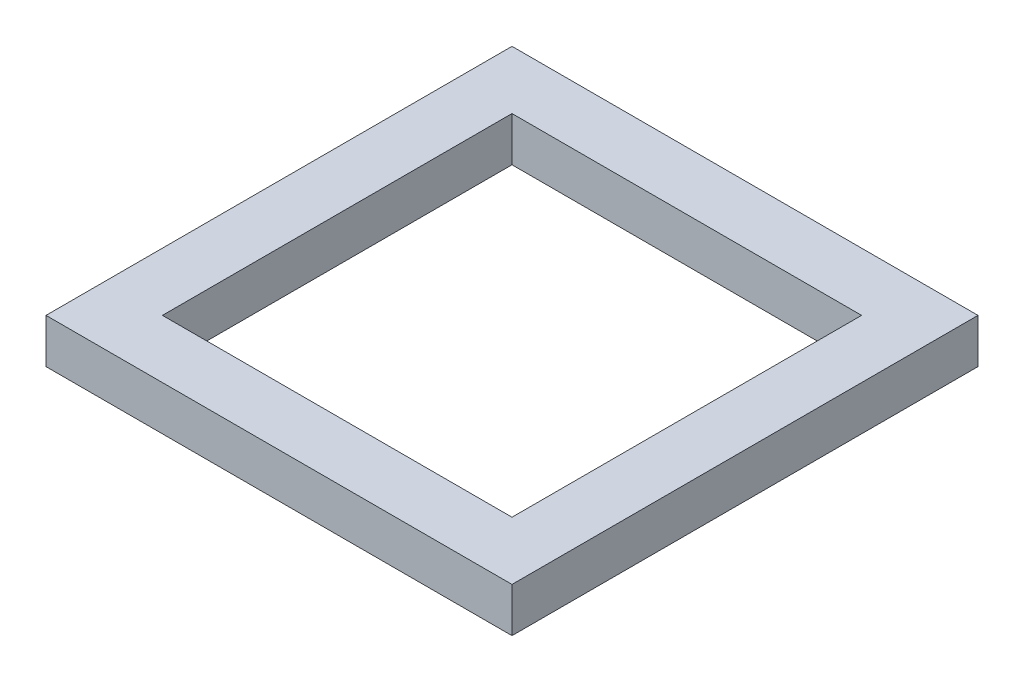
ISO-10303-21;
HEADER;
FILE_DESCRIPTION(('STEP AP214'),'2;1');
FILE_NAME('part.step','',(''),(''),'','','');
FILE_SCHEMA(('AUTOMOTIVE_DESIGN { 1 0 10303 214 1 1 1 1 }'));
ENDSEC;
DATA;
#1=APPLICATION_CONTEXT('core data for automotive mechanical design processes');
#2=APPLICATION_PROTOCOL_DEFINITION('international standard','automotive_design',2000,#1);
#3=PRODUCT_CONTEXT('',#1,'mechanical');
#4=PRODUCT('Part','Part','',(#3));
#5=PRODUCT_RELATED_PRODUCT_CATEGORY('part','',(#4));
#6=PRODUCT_DEFINITION_FORMATION('','',#4);
#7=PRODUCT_DEFINITION_CONTEXT('part definition',#1,'design');
#8=PRODUCT_DEFINITION('design','',#6,#7);
#9=PRODUCT_DEFINITION_SHAPE('','',#8);
#10=(LENGTH_UNIT() NAMED_UNIT(*) SI_UNIT(.MILLI.,.METRE.));
#11=(NAMED_UNIT(*) PLANE_ANGLE_UNIT() SI_UNIT($,.RADIAN.));
#12=(NAMED_UNIT(*) SI_UNIT($,.STERADIAN.) SOLID_ANGLE_UNIT());
#13=UNCERTAINTY_MEASURE_WITH_UNIT(LENGTH_MEASURE(1.E-05),#10,'distance_accuracy_value','');
#14=(GEOMETRIC_REPRESENTATION_CONTEXT(3) GLOBAL_UNCERTAINTY_ASSIGNED_CONTEXT((#13)) GLOBAL_UNIT_ASSIGNED_CONTEXT((#10,
#11,#12)) REPRESENTATION_CONTEXT('',''));
#15=CARTESIAN_POINT('',(0.,0.,0.));
#16=DIRECTION('',(0.,0.,1.));
#17=DIRECTION('',(1.,0.,0.));
#18=AXIS2_PLACEMENT_3D('',#15,#16,#17);
#19=CARTESIAN_POINT('',(0.,5.08,0.));
#20=DIRECTION('',(0.,1.,0.));
#21=DIRECTION('',(0.,0.,1.));
#22=AXIS2_PLACEMENT_3D('',#19,#20,#21);
#23=PLANE('',#22);
#24=DIRECTION('',(0.,0.,1.));
#25=VECTOR('',#24,1.);
#26=CARTESIAN_POINT('',(-17.9545454545455,5.08,-25.7954545454546));
#27=LINE('',#26,#25);
#28=CARTESIAN_POINT('',(-17.9545454545455,5.08,-25.7954545454546));
#29=VERTEX_POINT('',#28);
#30=CARTESIAN_POINT('',(-17.9545454545455,5.08,27.5245454545454));
#31=VERTEX_POINT('',#30);
#32=EDGE_CURVE('E134',#29,#31,#27,.T.);
#33=ORIENTED_EDGE('',*,*,#32,.T.);
#34=DIRECTION('',(1.,0.,0.));
#35=VECTOR('',#34,1.);
#36=CARTESIAN_POINT('',(-17.9545454545455,5.08,27.5245454545454));
#37=LINE('',#36,#35);
#38=CARTESIAN_POINT('',(35.3654545454545,5.08,27.5245454545454));
#39=VERTEX_POINT('',#38);
#40=EDGE_CURVE('E137',#31,#39,#37,.T.);
#41=ORIENTED_EDGE('',*,*,#40,.T.);
#42=DIRECTION('',(0.,0.,-1.));
#43=VECTOR('',#42,1.);
#44=CARTESIAN_POINT('',(35.3654545454545,5.08,-25.7954545454546));
#45=LINE('',#44,#43);
#46=CARTESIAN_POINT('',(35.3654545454545,5.08,-25.7954545454546));
#47=VERTEX_POINT('',#46);
#48=EDGE_CURVE('E140',#39,#47,#45,.T.);
#49=ORIENTED_EDGE('',*,*,#48,.T.);
#50=DIRECTION('',(-1.,0.,0.));
#51=VECTOR('',#50,1.);
#52=CARTESIAN_POINT('',(-17.9545454545455,5.08,-25.7954545454546));
#53=LINE('',#52,#51);
#54=EDGE_CURVE('E142',#47,#29,#53,.T.);
#55=ORIENTED_EDGE('',*,*,#54,.T.);
#56=EDGE_LOOP('',(#33,#41,#49,#55));
#57=FACE_BOUND('',#56,.T.);
#58=DIRECTION('',(1.,0.,0.));
#59=VECTOR('',#58,1.);
#60=CARTESIAN_POINT('',(-11.2945454545455,5.08,20.8645454545454));
#61=LINE('',#60,#59);
#62=CARTESIAN_POINT('',(-11.2945454545455,5.08,20.8645454545454));
#63=VERTEX_POINT('',#62);
#64=CARTESIAN_POINT('',(28.7054545454545,5.08,20.8645454545454));
#65=VERTEX_POINT('',#64);
#66=EDGE_CURVE('E106',#63,#65,#61,.T.);
#67=ORIENTED_EDGE('',*,*,#66,.F.);
#68=DIRECTION('',(0.,0.,1.));
#69=VECTOR('',#68,1.);
#70=CARTESIAN_POINT('',(-11.2945454545455,5.08,-19.1354545454546));
#71=LINE('',#70,#69);
#72=CARTESIAN_POINT('',(-11.2945454545455,5.08,-19.1354545454546));
#73=VERTEX_POINT('',#72);
#74=EDGE_CURVE('E98',#73,#63,#71,.T.);
#75=ORIENTED_EDGE('',*,*,#74,.F.);
#76=DIRECTION('',(-1.,0.,0.));
#77=VECTOR('',#76,1.);
#78=CARTESIAN_POINT('',(-11.2945454545455,5.08,-19.1354545454546));
#79=LINE('',#78,#77);
#80=CARTESIAN_POINT('',(28.7054545454545,5.08,-19.1354545454546));
#81=VERTEX_POINT('',#80);
#82=EDGE_CURVE('E120',#81,#73,#79,.T.);
#83=ORIENTED_EDGE('',*,*,#82,.F.);
#84=DIRECTION('',(0.,0.,-1.));
#85=VECTOR('',#84,1.);
#86=CARTESIAN_POINT('',(28.7054545454545,5.08,-19.1354545454546));
#87=LINE('',#86,#85);
#88=EDGE_CURVE('E118',#65,#81,#87,.T.);
#89=ORIENTED_EDGE('',*,*,#88,.F.);
#90=EDGE_LOOP('',(#67,#75,#83,#89));
#91=FACE_BOUND('',#90,.T.);
#92=ADVANCED_FACE('F33',(#57,#91),#23,.T.);
#93=CARTESIAN_POINT('',(0.,0.,0.));
#94=DIRECTION('',(0.,1.,0.));
#95=DIRECTION('',(0.,0.,1.));
#96=AXIS2_PLACEMENT_3D('',#93,#94,#95);
#97=PLANE('',#96);
#98=DIRECTION('',(0.,0.,1.));
#99=VECTOR('',#98,1.);
#100=CARTESIAN_POINT('',(-17.9545454545455,0.,-25.7954545454546));
#101=LINE('',#100,#99);
#102=CARTESIAN_POINT('',(-17.9545454545455,0.,-25.7954545454546));
#103=VERTEX_POINT('',#102);
#104=CARTESIAN_POINT('',(-17.9545454545455,0.,27.5245454545454));
#105=VERTEX_POINT('',#104);
#106=EDGE_CURVE('E114',#103,#105,#101,.T.);
#107=ORIENTED_EDGE('',*,*,#106,.F.);
#108=DIRECTION('',(-1.,0.,0.));
#109=VECTOR('',#108,1.);
#110=CARTESIAN_POINT('',(-17.9545454545455,0.,-25.7954545454546));
#111=LINE('',#110,#109);
#112=CARTESIAN_POINT('',(35.3654545454545,0.,-25.7954545454546));
#113=VERTEX_POINT('',#112);
#114=EDGE_CURVE('E138',#113,#103,#111,.T.);
#115=ORIENTED_EDGE('',*,*,#114,.F.);
#116=DIRECTION('',(0.,0.,-1.));
#117=VECTOR('',#116,1.);
#118=CARTESIAN_POINT('',(35.3654545454545,0.,-25.7954545454546));
#119=LINE('',#118,#117);
#120=CARTESIAN_POINT('',(35.3654545454545,0.,27.5245454545454));
#121=VERTEX_POINT('',#120);
#122=EDGE_CURVE('E149',#121,#113,#119,.T.);
#123=ORIENTED_EDGE('',*,*,#122,.F.);
#124=DIRECTION('',(1.,0.,0.));
#125=VECTOR('',#124,1.);
#126=CARTESIAN_POINT('',(-17.9545454545455,0.,27.5245454545454));
#127=LINE('',#126,#125);
#128=EDGE_CURVE('E147',#105,#121,#127,.T.);
#129=ORIENTED_EDGE('',*,*,#128,.F.);
#130=EDGE_LOOP('',(#107,#115,#123,#129));
#131=FACE_BOUND('',#130,.T.);
#132=DIRECTION('',(0.,0.,1.));
#133=VECTOR('',#132,1.);
#134=CARTESIAN_POINT('',(-11.2945454545455,0.,-19.1354545454546));
#135=LINE('',#134,#133);
#136=CARTESIAN_POINT('',(-11.2945454545455,0.,-19.1354545454546));
#137=VERTEX_POINT('',#136);
#138=CARTESIAN_POINT('',(-11.2945454545455,0.,20.8645454545454));
#139=VERTEX_POINT('',#138);
#140=EDGE_CURVE('E56',#137,#139,#135,.T.);
#141=ORIENTED_EDGE('',*,*,#140,.T.);
#142=DIRECTION('',(1.,0.,0.));
#143=VECTOR('',#142,1.);
#144=CARTESIAN_POINT('',(-11.2945454545455,0.,20.8645454545454));
#145=LINE('',#144,#143);
#146=CARTESIAN_POINT('',(28.7054545454545,0.,20.8645454545454));
#147=VERTEX_POINT('',#146);
#148=EDGE_CURVE('E113',#139,#147,#145,.T.);
#149=ORIENTED_EDGE('',*,*,#148,.T.);
#150=DIRECTION('',(0.,0.,-1.));
#151=VECTOR('',#150,1.);
#152=CARTESIAN_POINT('',(28.7054545454545,0.,-19.1354545454546));
#153=LINE('',#152,#151);
#154=CARTESIAN_POINT('',(28.7054545454545,0.,-19.1354545454546));
#155=VERTEX_POINT('',#154);
#156=EDGE_CURVE('E126',#147,#155,#153,.T.);
#157=ORIENTED_EDGE('',*,*,#156,.T.);
#158=DIRECTION('',(-1.,0.,0.));
#159=VECTOR('',#158,1.);
#160=CARTESIAN_POINT('',(-11.2945454545455,0.,-19.1354545454546));
#161=LINE('',#160,#159);
#162=EDGE_CURVE('E107',#155,#137,#161,.T.);
#163=ORIENTED_EDGE('',*,*,#162,.T.);
#164=EDGE_LOOP('',(#141,#149,#157,#163));
#165=FACE_BOUND('',#164,.T.);
#166=ADVANCED_FACE('F167',(#131,#165),#97,.F.);
#167=CARTESIAN_POINT('',(-17.9545454545455,5.08,-25.7954545454546));
#168=DIRECTION('',(1.,0.,0.));
#169=DIRECTION('',(0.,0.,-1.));
#170=AXIS2_PLACEMENT_3D('',#167,#168,#169);
#171=PLANE('',#170);
#172=ORIENTED_EDGE('',*,*,#106,.T.);
#173=DIRECTION('',(0.,-1.,0.));
#174=VECTOR('',#173,1.);
#175=CARTESIAN_POINT('',(-17.9545454545455,5.08,27.5245454545454));
#176=LINE('',#175,#174);
#177=EDGE_CURVE('E11',#31,#105,#176,.T.);
#178=ORIENTED_EDGE('',*,*,#177,.F.);
#179=ORIENTED_EDGE('',*,*,#32,.F.);
#180=DIRECTION('',(0.,-1.,0.));
#181=VECTOR('',#180,1.);
#182=CARTESIAN_POINT('',(-17.9545454545455,5.08,-25.7954545454546));
#183=LINE('',#182,#181);
#184=EDGE_CURVE('E144',#29,#103,#183,.T.);
#185=ORIENTED_EDGE('',*,*,#184,.T.);
#186=EDGE_LOOP('',(#172,#178,#179,#185));
#187=FACE_BOUND('',#186,.T.);
#188=ADVANCED_FACE('F35',(#187),#171,.F.);
#189=CARTESIAN_POINT('',(-17.9545454545455,5.08,27.5245454545454));
#190=DIRECTION('',(0.,0.,-1.));
#191=DIRECTION('',(-1.,0.,0.));
#192=AXIS2_PLACEMENT_3D('',#189,#190,#191);
#193=PLANE('',#192);
#194=ORIENTED_EDGE('',*,*,#128,.T.);
#195=DIRECTION('',(0.,-1.,0.));
#196=VECTOR('',#195,1.);
#197=CARTESIAN_POINT('',(35.3654545454545,5.08,27.5245454545454));
#198=LINE('',#197,#196);
#199=EDGE_CURVE('E41',#39,#121,#198,.T.);
#200=ORIENTED_EDGE('',*,*,#199,.F.);
#201=ORIENTED_EDGE('',*,*,#40,.F.);
#202=ORIENTED_EDGE('',*,*,#177,.T.);
#203=EDGE_LOOP('',(#194,#200,#201,#202));
#204=FACE_BOUND('',#203,.T.);
#205=ADVANCED_FACE('F177',(#204),#193,.F.);
#206=CARTESIAN_POINT('',(35.3654545454545,5.08,-25.7954545454546));
#207=DIRECTION('',(-1.,0.,0.));
#208=DIRECTION('',(0.,0.,1.));
#209=AXIS2_PLACEMENT_3D('',#206,#207,#208);
#210=PLANE('',#209);
#211=ORIENTED_EDGE('',*,*,#122,.T.);
#212=DIRECTION('',(0.,-1.,0.));
#213=VECTOR('',#212,1.);
#214=CARTESIAN_POINT('',(35.3654545454545,5.08,-25.7954545454546));
#215=LINE('',#214,#213);
#216=EDGE_CURVE('E154',#47,#113,#215,.T.);
#217=ORIENTED_EDGE('',*,*,#216,.F.);
#218=ORIENTED_EDGE('',*,*,#48,.F.);
#219=ORIENTED_EDGE('',*,*,#199,.T.);
#220=EDGE_LOOP('',(#211,#217,#218,#219));
#221=FACE_BOUND('',#220,.T.);
#222=ADVANCED_FACE('F161',(#221),#210,.F.);
#223=CARTESIAN_POINT('',(-17.9545454545455,5.08,-25.7954545454546));
#224=DIRECTION('',(0.,0.,1.));
#225=DIRECTION('',(1.,0.,0.));
#226=AXIS2_PLACEMENT_3D('',#223,#224,#225);
#227=PLANE('',#226);
#228=ORIENTED_EDGE('',*,*,#114,.T.);
#229=ORIENTED_EDGE('',*,*,#184,.F.);
#230=ORIENTED_EDGE('',*,*,#54,.F.);
#231=ORIENTED_EDGE('',*,*,#216,.T.);
#232=EDGE_LOOP('',(#228,#229,#230,#231));
#233=FACE_BOUND('',#232,.T.);
#234=ADVANCED_FACE('F171',(#233),#227,.F.);
#235=CARTESIAN_POINT('',(-11.2945454545455,5.08,-19.1354545454546));
#236=DIRECTION('',(1.,0.,0.));
#237=DIRECTION('',(0.,0.,-1.));
#238=AXIS2_PLACEMENT_3D('',#235,#236,#237);
#239=PLANE('',#238);
#240=ORIENTED_EDGE('',*,*,#140,.F.);
#241=DIRECTION('',(0.,-1.,0.));
#242=VECTOR('',#241,1.);
#243=CARTESIAN_POINT('',(-11.2945454545455,5.08,-19.1354545454546));
#244=LINE('',#243,#242);
#245=EDGE_CURVE('E102',#73,#137,#244,.T.);
#246=ORIENTED_EDGE('',*,*,#245,.F.);
#247=ORIENTED_EDGE('',*,*,#74,.T.);
#248=DIRECTION('',(0.,-1.,0.));
#249=VECTOR('',#248,1.);
#250=CARTESIAN_POINT('',(-11.2945454545455,5.08,20.8645454545454));
#251=LINE('',#250,#249);
#252=EDGE_CURVE('E101',#63,#139,#251,.T.);
#253=ORIENTED_EDGE('',*,*,#252,.T.);
#254=EDGE_LOOP('',(#240,#246,#247,#253));
#255=FACE_BOUND('',#254,.T.);
#256=ADVANCED_FACE('F100',(#255),#239,.T.);
#257=CARTESIAN_POINT('',(-11.2945454545455,5.08,20.8645454545454));
#258=DIRECTION('',(0.,0.,-1.));
#259=DIRECTION('',(-1.,0.,0.));
#260=AXIS2_PLACEMENT_3D('',#257,#258,#259);
#261=PLANE('',#260);
#262=ORIENTED_EDGE('',*,*,#148,.F.);
#263=ORIENTED_EDGE('',*,*,#252,.F.);
#264=ORIENTED_EDGE('',*,*,#66,.T.);
#265=DIRECTION('',(0.,-1.,0.));
#266=VECTOR('',#265,1.);
#267=CARTESIAN_POINT('',(28.7054545454545,5.08,20.8645454545454));
#268=LINE('',#267,#266);
#269=EDGE_CURVE('E115',#65,#147,#268,.T.);
#270=ORIENTED_EDGE('',*,*,#269,.T.);
#271=EDGE_LOOP('',(#262,#263,#264,#270));
#272=FACE_BOUND('',#271,.T.);
#273=ADVANCED_FACE('F110',(#272),#261,.T.);
#274=CARTESIAN_POINT('',(28.7054545454545,5.08,-19.1354545454546));
#275=DIRECTION('',(-1.,0.,0.));
#276=DIRECTION('',(0.,0.,1.));
#277=AXIS2_PLACEMENT_3D('',#274,#275,#276);
#278=PLANE('',#277);
#279=ORIENTED_EDGE('',*,*,#156,.F.);
#280=ORIENTED_EDGE('',*,*,#269,.F.);
#281=ORIENTED_EDGE('',*,*,#88,.T.);
#282=DIRECTION('',(0.,-1.,0.));
#283=VECTOR('',#282,1.);
#284=CARTESIAN_POINT('',(28.7054545454545,5.08,-19.1354545454546));
#285=LINE('',#284,#283);
#286=EDGE_CURVE('E48',#81,#155,#285,.T.);
#287=ORIENTED_EDGE('',*,*,#286,.T.);
#288=EDGE_LOOP('',(#279,#280,#281,#287));
#289=FACE_BOUND('',#288,.T.);
#290=ADVANCED_FACE('F200',(#289),#278,.T.);
#291=CARTESIAN_POINT('',(-11.2945454545455,5.08,-19.1354545454546));
#292=DIRECTION('',(0.,0.,1.));
#293=DIRECTION('',(1.,0.,0.));
#294=AXIS2_PLACEMENT_3D('',#291,#292,#293);
#295=PLANE('',#294);
#296=ORIENTED_EDGE('',*,*,#162,.F.);
#297=ORIENTED_EDGE('',*,*,#286,.F.);
#298=ORIENTED_EDGE('',*,*,#82,.T.);
#299=ORIENTED_EDGE('',*,*,#245,.T.);
#300=EDGE_LOOP('',(#296,#297,#298,#299));
#301=FACE_BOUND('',#300,.T.);
#302=ADVANCED_FACE('F204',(#301),#295,.T.);
#303=CLOSED_SHELL('',(#92,#166,#188,#205,#222,#234,#256,#273,#290,#302));
#304=MANIFOLD_SOLID_BREP('B2',#303);
#305=ADVANCED_BREP_SHAPE_REPRESENTATION('',(#18,#304),#14);
#306=SHAPE_DEFINITION_REPRESENTATION(#9,#305);
ENDSEC;
END-ISO-10303-21;
